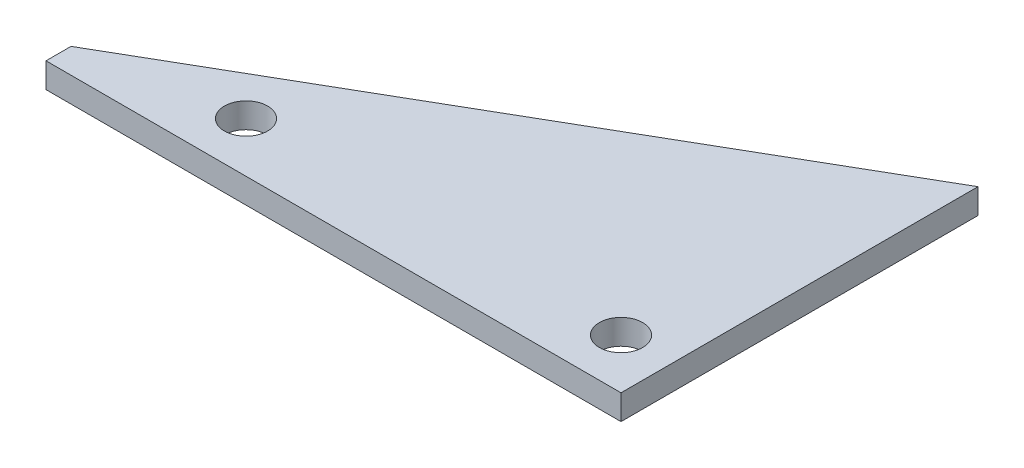
ISO-10303-21;
HEADER;
FILE_DESCRIPTION(('STEP AP214'),'2;1');
FILE_NAME('part.step','',(''),(''),'','','');
FILE_SCHEMA(('AUTOMOTIVE_DESIGN { 1 0 10303 214 1 1 1 1 }'));
ENDSEC;
DATA;
#1=APPLICATION_CONTEXT('core data for automotive mechanical design processes');
#2=APPLICATION_PROTOCOL_DEFINITION('international standard','automotive_design',2000,#1);
#3=PRODUCT_CONTEXT('',#1,'mechanical');
#4=PRODUCT('Part','Part','',(#3));
#5=PRODUCT_RELATED_PRODUCT_CATEGORY('part','',(#4));
#6=PRODUCT_DEFINITION_FORMATION('','',#4);
#7=PRODUCT_DEFINITION_CONTEXT('part definition',#1,'design');
#8=PRODUCT_DEFINITION('design','',#6,#7);
#9=PRODUCT_DEFINITION_SHAPE('','',#8);
#10=(LENGTH_UNIT() NAMED_UNIT(*) SI_UNIT(.MILLI.,.METRE.));
#11=(NAMED_UNIT(*) PLANE_ANGLE_UNIT() SI_UNIT($,.RADIAN.));
#12=(NAMED_UNIT(*) SI_UNIT($,.STERADIAN.) SOLID_ANGLE_UNIT());
#13=UNCERTAINTY_MEASURE_WITH_UNIT(LENGTH_MEASURE(1.E-05),#10,'distance_accuracy_value','');
#14=(GEOMETRIC_REPRESENTATION_CONTEXT(3) GLOBAL_UNCERTAINTY_ASSIGNED_CONTEXT((#13)) GLOBAL_UNIT_ASSIGNED_CONTEXT((#10,
#11,#12)) REPRESENTATION_CONTEXT('',''));
#15=CARTESIAN_POINT('',(0.,0.,0.));
#16=DIRECTION('',(0.,0.,1.));
#17=DIRECTION('',(1.,0.,0.));
#18=AXIS2_PLACEMENT_3D('',#15,#16,#17);
#19=CARTESIAN_POINT('',(0.,3.175,0.));
#20=DIRECTION('',(1.,0.,0.));
#21=DIRECTION('',(0.,0.,-1.));
#22=AXIS2_PLACEMENT_3D('',#19,#20,#21);
#23=PLANE('',#22);
#24=DIRECTION('',(0.,0.,1.));
#25=VECTOR('',#24,1.);
#26=CARTESIAN_POINT('',(0.,0.,0.));
#27=LINE('',#26,#25);
#28=CARTESIAN_POINT('',(0.,0.,-3.175));
#29=VERTEX_POINT('',#28);
#30=CARTESIAN_POINT('',(0.,0.,0.));
#31=VERTEX_POINT('',#30);
#32=EDGE_CURVE('E96',#29,#31,#27,.T.);
#33=ORIENTED_EDGE('',*,*,#32,.T.);
#34=DIRECTION('',(0.,-1.,0.));
#35=VECTOR('',#34,1.);
#36=CARTESIAN_POINT('',(0.,3.175,0.));
#37=LINE('',#36,#35);
#38=CARTESIAN_POINT('',(0.,3.175,0.));
#39=VERTEX_POINT('',#38);
#40=EDGE_CURVE('E11',#39,#31,#37,.T.);
#41=ORIENTED_EDGE('',*,*,#40,.F.);
#42=DIRECTION('',(0.,0.,1.));
#43=VECTOR('',#42,1.);
#44=CARTESIAN_POINT('',(0.,3.175,0.));
#45=LINE('',#44,#43);
#46=CARTESIAN_POINT('',(0.,3.175,-3.175));
#47=VERTEX_POINT('',#46);
#48=EDGE_CURVE('E84',#47,#39,#45,.T.);
#49=ORIENTED_EDGE('',*,*,#48,.F.);
#50=DIRECTION('',(0.,-1.,0.));
#51=VECTOR('',#50,1.);
#52=CARTESIAN_POINT('',(0.,3.175,-3.175));
#53=LINE('',#52,#51);
#54=EDGE_CURVE('E92',#47,#29,#53,.T.);
#55=ORIENTED_EDGE('',*,*,#54,.T.);
#56=EDGE_LOOP('',(#33,#41,#49,#55));
#57=FACE_BOUND('',#56,.T.);
#58=ADVANCED_FACE('F33',(#57),#23,.F.);
#59=CARTESIAN_POINT('',(0.,3.175,0.));
#60=DIRECTION('',(0.,0.,-1.));
#61=DIRECTION('',(-1.,0.,0.));
#62=AXIS2_PLACEMENT_3D('',#59,#60,#61);
#63=PLANE('',#62);
#64=DIRECTION('',(1.,0.,0.));
#65=VECTOR('',#64,1.);
#66=CARTESIAN_POINT('',(0.,0.,0.));
#67=LINE('',#66,#65);
#68=CARTESIAN_POINT('',(73.025,0.,0.));
#69=VERTEX_POINT('',#68);
#70=EDGE_CURVE('E88',#31,#69,#67,.T.);
#71=ORIENTED_EDGE('',*,*,#70,.T.);
#72=DIRECTION('',(0.,-1.,0.));
#73=VECTOR('',#72,1.);
#74=CARTESIAN_POINT('',(73.025,3.175,0.));
#75=LINE('',#74,#73);
#76=CARTESIAN_POINT('',(73.025,3.175,0.));
#77=VERTEX_POINT('',#76);
#78=EDGE_CURVE('E41',#77,#69,#75,.T.);
#79=ORIENTED_EDGE('',*,*,#78,.F.);
#80=DIRECTION('',(1.,0.,0.));
#81=VECTOR('',#80,1.);
#82=CARTESIAN_POINT('',(0.,3.175,0.));
#83=LINE('',#82,#81);
#84=EDGE_CURVE('E79',#39,#77,#83,.T.);
#85=ORIENTED_EDGE('',*,*,#84,.F.);
#86=ORIENTED_EDGE('',*,*,#40,.T.);
#87=EDGE_LOOP('',(#71,#79,#85,#86));
#88=FACE_BOUND('',#87,.T.);
#89=ADVANCED_FACE('F87',(#88),#63,.F.);
#90=CARTESIAN_POINT('',(73.025,3.175,0.));
#91=DIRECTION('',(-1.,0.,0.));
#92=DIRECTION('',(0.,0.,1.));
#93=AXIS2_PLACEMENT_3D('',#90,#91,#92);
#94=PLANE('',#93);
#95=DIRECTION('',(0.,0.,-1.));
#96=VECTOR('',#95,1.);
#97=CARTESIAN_POINT('',(73.025,0.,0.));
#98=LINE('',#97,#96);
#99=CARTESIAN_POINT('',(73.025,0.,-45.3360034075726));
#100=VERTEX_POINT('',#99);
#101=EDGE_CURVE('E66',#69,#100,#98,.T.);
#102=ORIENTED_EDGE('',*,*,#101,.T.);
#103=DIRECTION('',(0.,-1.,0.));
#104=VECTOR('',#103,1.);
#105=CARTESIAN_POINT('',(73.025,3.175,-45.3360034075726));
#106=LINE('',#105,#104);
#107=CARTESIAN_POINT('',(73.025,3.175,-45.3360034075726));
#108=VERTEX_POINT('',#107);
#109=EDGE_CURVE('E89',#108,#100,#106,.T.);
#110=ORIENTED_EDGE('',*,*,#109,.F.);
#111=DIRECTION('',(0.,0.,-1.));
#112=VECTOR('',#111,1.);
#113=CARTESIAN_POINT('',(73.025,3.175,0.));
#114=LINE('',#113,#112);
#115=EDGE_CURVE('E82',#77,#108,#114,.T.);
#116=ORIENTED_EDGE('',*,*,#115,.F.);
#117=ORIENTED_EDGE('',*,*,#78,.T.);
#118=EDGE_LOOP('',(#102,#110,#116,#117));
#119=FACE_BOUND('',#118,.T.);
#120=ADVANCED_FACE('F90',(#119),#94,.F.);
#121=CARTESIAN_POINT('',(0.,3.175,-3.175));
#122=DIRECTION('',(0.500000000000001,0.,0.866025403784438));
#123=DIRECTION('',(0.866025403784438,0.,-0.500000000000001));
#124=AXIS2_PLACEMENT_3D('',#121,#122,#123);
#125=PLANE('',#124);
#126=DIRECTION('',(-0.866025403784438,0.,0.500000000000001));
#127=VECTOR('',#126,1.);
#128=CARTESIAN_POINT('',(0.,0.,-3.175));
#129=LINE('',#128,#127);
#130=EDGE_CURVE('E72',#100,#29,#129,.T.);
#131=ORIENTED_EDGE('',*,*,#130,.T.);
#132=ORIENTED_EDGE('',*,*,#54,.F.);
#133=DIRECTION('',(-0.866025403784438,0.,0.500000000000001));
#134=VECTOR('',#133,1.);
#135=CARTESIAN_POINT('',(0.,3.175,-3.175));
#136=LINE('',#135,#134);
#137=EDGE_CURVE('E49',#108,#47,#136,.T.);
#138=ORIENTED_EDGE('',*,*,#137,.F.);
#139=ORIENTED_EDGE('',*,*,#109,.T.);
#140=EDGE_LOOP('',(#131,#132,#138,#139));
#141=FACE_BOUND('',#140,.T.);
#142=ADVANCED_FACE('F104',(#141),#125,.F.);
#143=CARTESIAN_POINT('',(0.,3.175,0.));
#144=DIRECTION('',(0.,-1.,0.));
#145=DIRECTION('',(0.,0.,-1.));
#146=AXIS2_PLACEMENT_3D('',#143,#144,#145);
#147=PLANE('',#146);
#148=CARTESIAN_POINT('',(19.05,3.175,-6.35));
#149=DIRECTION('',(0.,1.,0.));
#150=DIRECTION('',(0.,0.,1.));
#151=AXIS2_PLACEMENT_3D('',#148,#149,#150);
#152=CIRCLE('',#151,2.75);
#153=CARTESIAN_POINT('',(19.05,3.175,-3.6));
#154=VERTEX_POINT('',#153);
#155=EDGE_CURVE('E118',#154,#154,#152,.T.);
#156=ORIENTED_EDGE('',*,*,#155,.F.);
#157=EDGE_LOOP('',(#156));
#158=FACE_BOUND('',#157,.T.);
#159=CARTESIAN_POINT('',(66.675,3.175,-6.35));
#160=DIRECTION('',(0.,1.,0.));
#161=DIRECTION('',(0.,0.,1.));
#162=AXIS2_PLACEMENT_3D('',#159,#160,#161);
#163=CIRCLE('',#162,2.75);
#164=CARTESIAN_POINT('',(66.675,3.175,-3.6));
#165=VERTEX_POINT('',#164);
#166=EDGE_CURVE('E112',#165,#165,#163,.T.);
#167=ORIENTED_EDGE('',*,*,#166,.F.);
#168=EDGE_LOOP('',(#167));
#169=FACE_BOUND('',#168,.T.);
#170=ORIENTED_EDGE('',*,*,#48,.T.);
#171=ORIENTED_EDGE('',*,*,#84,.T.);
#172=ORIENTED_EDGE('',*,*,#115,.T.);
#173=ORIENTED_EDGE('',*,*,#137,.T.);
#174=EDGE_LOOP('',(#170,#171,#172,#173));
#175=FACE_BOUND('',#174,.T.);
#176=ADVANCED_FACE('F80',(#158,#169,#175),#147,.F.);
#177=CARTESIAN_POINT('',(0.,0.,0.));
#178=DIRECTION('',(0.,-1.,0.));
#179=DIRECTION('',(0.,0.,-1.));
#180=AXIS2_PLACEMENT_3D('',#177,#178,#179);
#181=PLANE('',#180);
#182=CARTESIAN_POINT('',(19.05,0.,-6.35));
#183=DIRECTION('',(0.,1.,0.));
#184=DIRECTION('',(0.,0.,1.));
#185=AXIS2_PLACEMENT_3D('',#182,#183,#184);
#186=CIRCLE('',#185,2.75);
#187=CARTESIAN_POINT('',(19.05,0.,-3.6));
#188=VERTEX_POINT('',#187);
#189=EDGE_CURVE('E115',#188,#188,#186,.T.);
#190=ORIENTED_EDGE('',*,*,#189,.T.);
#191=EDGE_LOOP('',(#190));
#192=FACE_BOUND('',#191,.T.);
#193=CARTESIAN_POINT('',(66.675,0.,-6.35));
#194=DIRECTION('',(0.,1.,0.));
#195=DIRECTION('',(0.,0.,1.));
#196=AXIS2_PLACEMENT_3D('',#193,#194,#195);
#197=CIRCLE('',#196,2.75);
#198=CARTESIAN_POINT('',(66.675,0.,-3.6));
#199=VERTEX_POINT('',#198);
#200=EDGE_CURVE('E99',#199,#199,#197,.T.);
#201=ORIENTED_EDGE('',*,*,#200,.T.);
#202=EDGE_LOOP('',(#201));
#203=FACE_BOUND('',#202,.T.);
#204=ORIENTED_EDGE('',*,*,#32,.F.);
#205=ORIENTED_EDGE('',*,*,#130,.F.);
#206=ORIENTED_EDGE('',*,*,#101,.F.);
#207=ORIENTED_EDGE('',*,*,#70,.F.);
#208=EDGE_LOOP('',(#204,#205,#206,#207));
#209=FACE_BOUND('',#208,.T.);
#210=ADVANCED_FACE('F107',(#192,#203,#209),#181,.T.);
#211=CARTESIAN_POINT('',(66.675,3.175,-6.35));
#212=DIRECTION('',(0.,1.,0.));
#213=DIRECTION('',(0.,0.,1.));
#214=AXIS2_PLACEMENT_3D('',#211,#212,#213);
#215=CYLINDRICAL_SURFACE('',#214,2.75);
#216=ORIENTED_EDGE('',*,*,#200,.F.);
#217=EDGE_LOOP('',(#216));
#218=FACE_BOUND('',#217,.T.);
#219=ORIENTED_EDGE('',*,*,#166,.T.);
#220=EDGE_LOOP('',(#219));
#221=FACE_BOUND('',#220,.T.);
#222=ADVANCED_FACE('F129',(#218,#221),#215,.F.);
#223=CARTESIAN_POINT('',(19.05,3.175,-6.35));
#224=DIRECTION('',(0.,1.,0.));
#225=DIRECTION('',(0.,0.,1.));
#226=AXIS2_PLACEMENT_3D('',#223,#224,#225);
#227=CYLINDRICAL_SURFACE('',#226,2.75);
#228=ORIENTED_EDGE('',*,*,#189,.F.);
#229=EDGE_LOOP('',(#228));
#230=FACE_BOUND('',#229,.T.);
#231=ORIENTED_EDGE('',*,*,#155,.T.);
#232=EDGE_LOOP('',(#231));
#233=FACE_BOUND('',#232,.T.);
#234=ADVANCED_FACE('F122',(#230,#233),#227,.F.);
#235=CLOSED_SHELL('',(#58,#89,#120,#142,#176,#210,#222,#234));
#236=MANIFOLD_SOLID_BREP('B2',#235);
#237=ADVANCED_BREP_SHAPE_REPRESENTATION('',(#18,#236),#14);
#238=SHAPE_DEFINITION_REPRESENTATION(#9,#237);
ENDSEC;
END-ISO-10303-21;
